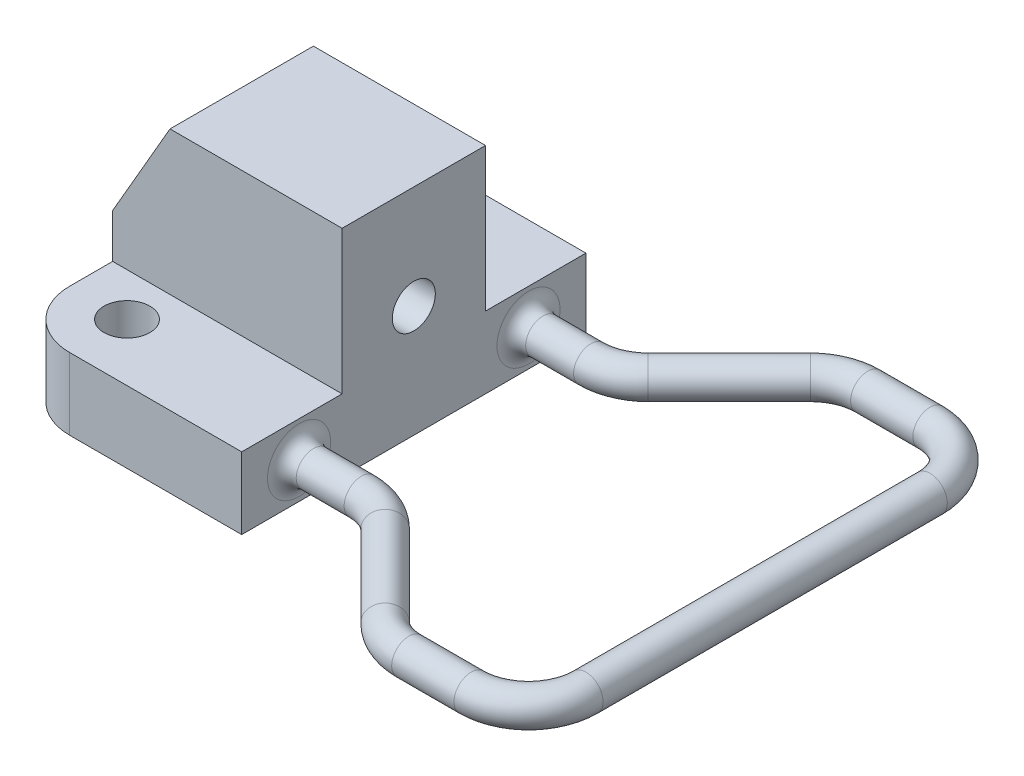
ISO-10303-21;
HEADER;
FILE_DESCRIPTION(('STEP AP214'),'2;1');
FILE_NAME('part.step','',(''),(''),'','','');
FILE_SCHEMA(('AUTOMOTIVE_DESIGN { 1 0 10303 214 1 1 1 1 }'));
ENDSEC;
DATA;
#1=APPLICATION_CONTEXT('core data for automotive mechanical design processes');
#2=APPLICATION_PROTOCOL_DEFINITION('international standard','automotive_design',2000,#1);
#3=PRODUCT_CONTEXT('',#1,'mechanical');
#4=PRODUCT('Part','Part','',(#3));
#5=PRODUCT_RELATED_PRODUCT_CATEGORY('part','',(#4));
#6=PRODUCT_DEFINITION_FORMATION('','',#4);
#7=PRODUCT_DEFINITION_CONTEXT('part definition',#1,'design');
#8=PRODUCT_DEFINITION('design','',#6,#7);
#9=PRODUCT_DEFINITION_SHAPE('','',#8);
#10=(LENGTH_UNIT() NAMED_UNIT(*) SI_UNIT(.MILLI.,.METRE.));
#11=(NAMED_UNIT(*) PLANE_ANGLE_UNIT() SI_UNIT($,.RADIAN.));
#12=(NAMED_UNIT(*) SI_UNIT($,.STERADIAN.) SOLID_ANGLE_UNIT());
#13=UNCERTAINTY_MEASURE_WITH_UNIT(LENGTH_MEASURE(1.E-05),#10,'distance_accuracy_value','');
#14=(GEOMETRIC_REPRESENTATION_CONTEXT(3) GLOBAL_UNCERTAINTY_ASSIGNED_CONTEXT((#13)) GLOBAL_UNIT_ASSIGNED_CONTEXT((#10,
#11,#12)) REPRESENTATION_CONTEXT('',''));
#15=CARTESIAN_POINT('',(0.,0.,0.));
#16=DIRECTION('',(0.,0.,1.));
#17=DIRECTION('',(1.,0.,0.));
#18=AXIS2_PLACEMENT_3D('',#15,#16,#17);
#19=CARTESIAN_POINT('',(40.,25.,-60.));
#20=DIRECTION('',(-1.,0.,0.));
#21=DIRECTION('',(0.,0.,1.));
#22=AXIS2_PLACEMENT_3D('',#19,#20,#21);
#23=PLANE('',#22);
#24=CARTESIAN_POINT('',(40.,12.5,40.));
#25=DIRECTION('',(-1.,0.,0.));
#26=DIRECTION('',(0.,0.,1.));
#27=AXIS2_PLACEMENT_3D('',#24,#25,#26);
#28=CIRCLE('',#27,11.);
#29=CARTESIAN_POINT('',(40.,12.5,51.));
#30=VERTEX_POINT('',#29);
#31=EDGE_CURVE('E61',#30,#30,#28,.T.);
#32=ORIENTED_EDGE('',*,*,#31,.T.);
#33=EDGE_LOOP('',(#32));
#34=FACE_BOUND('',#33,.T.);
#35=CARTESIAN_POINT('',(40.,12.5,-40.));
#36=DIRECTION('',(-1.,0.,0.));
#37=DIRECTION('',(0.,0.,1.));
#38=AXIS2_PLACEMENT_3D('',#35,#36,#37);
#39=CIRCLE('',#38,11.);
#40=CARTESIAN_POINT('',(40.,12.5,-29.));
#41=VERTEX_POINT('',#40);
#42=EDGE_CURVE('E177',#41,#41,#39,.T.);
#43=ORIENTED_EDGE('',*,*,#42,.T.);
#44=EDGE_LOOP('',(#43));
#45=FACE_BOUND('',#44,.T.);
#46=CARTESIAN_POINT('',(40.,39.,0.));
#47=DIRECTION('',(-1.,0.,0.));
#48=DIRECTION('',(0.,0.,1.));
#49=AXIS2_PLACEMENT_3D('',#46,#47,#48);
#50=CIRCLE('',#49,7.5);
#51=CARTESIAN_POINT('',(40.,39.,7.5));
#52=VERTEX_POINT('',#51);
#53=EDGE_CURVE('E250',#52,#52,#50,.T.);
#54=ORIENTED_EDGE('',*,*,#53,.T.);
#55=EDGE_LOOP('',(#54));
#56=FACE_BOUND('',#55,.T.);
#57=DIRECTION('',(0.,0.,-1.));
#58=VECTOR('',#57,1.);
#59=CARTESIAN_POINT('',(40.,0.,-60.));
#60=LINE('',#59,#58);
#61=CARTESIAN_POINT('',(40.,0.,60.));
#62=VERTEX_POINT('',#61);
#63=CARTESIAN_POINT('',(40.,0.,-60.));
#64=VERTEX_POINT('',#63);
#65=EDGE_CURVE('E153',#62,#64,#60,.T.);
#66=ORIENTED_EDGE('',*,*,#65,.T.);
#67=DIRECTION('',(0.,-1.,0.));
#68=VECTOR('',#67,1.);
#69=CARTESIAN_POINT('',(40.,25.,-60.));
#70=LINE('',#69,#68);
#71=CARTESIAN_POINT('',(40.,25.,-60.));
#72=VERTEX_POINT('',#71);
#73=EDGE_CURVE('E171',#72,#64,#70,.T.);
#74=ORIENTED_EDGE('',*,*,#73,.F.);
#75=DIRECTION('',(0.,0.,-1.));
#76=VECTOR('',#75,1.);
#77=CARTESIAN_POINT('',(40.,25.,-60.));
#78=LINE('',#77,#76);
#79=CARTESIAN_POINT('',(40.,25.,-25.));
#80=VERTEX_POINT('',#79);
#81=EDGE_CURVE('E113',#80,#72,#78,.T.);
#82=ORIENTED_EDGE('',*,*,#81,.F.);
#83=DIRECTION('',(0.,-1.,0.));
#84=VECTOR('',#83,1.);
#85=CARTESIAN_POINT('',(40.,75.,-25.));
#86=LINE('',#85,#84);
#87=CARTESIAN_POINT('',(40.,75.,-25.));
#88=VERTEX_POINT('',#87);
#89=EDGE_CURVE('E269',#88,#80,#86,.T.);
#90=ORIENTED_EDGE('',*,*,#89,.F.);
#91=DIRECTION('',(0.,0.,-1.));
#92=VECTOR('',#91,1.);
#93=CARTESIAN_POINT('',(40.,75.,25.));
#94=LINE('',#93,#92);
#95=CARTESIAN_POINT('',(40.,75.,25.));
#96=VERTEX_POINT('',#95);
#97=EDGE_CURVE('E266',#96,#88,#94,.T.);
#98=ORIENTED_EDGE('',*,*,#97,.F.);
#99=DIRECTION('',(0.,-1.,0.));
#100=VECTOR('',#99,1.);
#101=CARTESIAN_POINT('',(40.,75.,25.));
#102=LINE('',#101,#100);
#103=CARTESIAN_POINT('',(40.,25.,25.));
#104=VERTEX_POINT('',#103);
#105=EDGE_CURVE('E257',#96,#104,#102,.T.);
#106=ORIENTED_EDGE('',*,*,#105,.T.);
#107=CARTESIAN_POINT('',(40.,25.,60.));
#108=VERTEX_POINT('',#107);
#109=EDGE_CURVE('E299',#108,#104,#78,.T.);
#110=ORIENTED_EDGE('',*,*,#109,.F.);
#111=DIRECTION('',(0.,-1.,0.));
#112=VECTOR('',#111,1.);
#113=CARTESIAN_POINT('',(40.,25.,60.));
#114=LINE('',#113,#112);
#115=EDGE_CURVE('E148',#108,#62,#114,.T.);
#116=ORIENTED_EDGE('',*,*,#115,.T.);
#117=EDGE_LOOP('',(#66,#74,#82,#90,#98,#106,#110,#116));
#118=FACE_BOUND('',#117,.T.);
#119=ADVANCED_FACE('F53',(#34,#45,#56,#118),#23,.F.);
#120=CARTESIAN_POINT('',(-20.,25.,40.));
#121=DIRECTION('',(0.,1.,0.));
#122=DIRECTION('',(0.,0.,1.));
#123=AXIS2_PLACEMENT_3D('',#120,#121,#122);
#124=PLANE('',#123);
#125=CARTESIAN_POINT('',(-20.,25.,40.));
#126=DIRECTION('',(0.,1.,0.));
#127=DIRECTION('',(0.,0.,1.));
#128=AXIS2_PLACEMENT_3D('',#125,#126,#127);
#129=CIRCLE('',#128,8.);
#130=CARTESIAN_POINT('',(-20.,25.,48.));
#131=VERTEX_POINT('',#130);
#132=EDGE_CURVE('E157',#131,#131,#129,.T.);
#133=ORIENTED_EDGE('',*,*,#132,.F.);
#134=EDGE_LOOP('',(#133));
#135=FACE_BOUND('',#134,.T.);
#136=ORIENTED_EDGE('',*,*,#109,.T.);
#137=DIRECTION('',(-1.,0.,0.));
#138=VECTOR('',#137,1.);
#139=CARTESIAN_POINT('',(40.,25.,25.));
#140=LINE('',#139,#138);
#141=CARTESIAN_POINT('',(-40.,25.,25.));
#142=VERTEX_POINT('',#141);
#143=EDGE_CURVE('E130',#104,#142,#140,.T.);
#144=ORIENTED_EDGE('',*,*,#143,.T.);
#145=DIRECTION('',(0.,0.,1.));
#146=VECTOR('',#145,1.);
#147=CARTESIAN_POINT('',(-40.,25.,-39.9999999999998));
#148=LINE('',#147,#146);
#149=CARTESIAN_POINT('',(-40.,25.,39.9999999999999));
#150=VERTEX_POINT('',#149);
#151=EDGE_CURVE('E124',#142,#150,#148,.T.);
#152=ORIENTED_EDGE('',*,*,#151,.T.);
#153=CARTESIAN_POINT('',(-20.,25.,40.));
#154=DIRECTION('',(0.,1.,0.));
#155=DIRECTION('',(0.,0.,1.));
#156=AXIS2_PLACEMENT_3D('',#153,#154,#155);
#157=CIRCLE('',#156,20.);
#158=CARTESIAN_POINT('',(-19.9999999999999,25.,60.));
#159=VERTEX_POINT('',#158);
#160=EDGE_CURVE('E128',#150,#159,#157,.T.);
#161=ORIENTED_EDGE('',*,*,#160,.T.);
#162=DIRECTION('',(1.,0.,0.));
#163=VECTOR('',#162,1.);
#164=CARTESIAN_POINT('',(-19.9999999999999,25.,60.));
#165=LINE('',#164,#163);
#166=EDGE_CURVE('E77',#159,#108,#165,.T.);
#167=ORIENTED_EDGE('',*,*,#166,.T.);
#168=EDGE_LOOP('',(#136,#144,#152,#161,#167));
#169=FACE_BOUND('',#168,.T.);
#170=ADVANCED_FACE('F126',(#135,#169),#124,.T.);
#171=DIRECTION('',(-1.,0.,0.));
#172=VECTOR('',#171,1.);
#173=CARTESIAN_POINT('',(40.,25.,-25.));
#174=LINE('',#173,#172);
#175=CARTESIAN_POINT('',(-40.,25.,-25.));
#176=VERTEX_POINT('',#175);
#177=EDGE_CURVE('E272',#80,#176,#174,.T.);
#178=ORIENTED_EDGE('',*,*,#177,.F.);
#179=ORIENTED_EDGE('',*,*,#81,.T.);
#180=DIRECTION('',(-1.,0.,0.));
#181=VECTOR('',#180,1.);
#182=CARTESIAN_POINT('',(-19.9999999999999,25.,-60.));
#183=LINE('',#182,#181);
#184=CARTESIAN_POINT('',(-19.9999999999999,25.,-60.));
#185=VERTEX_POINT('',#184);
#186=EDGE_CURVE('E301',#72,#185,#183,.T.);
#187=ORIENTED_EDGE('',*,*,#186,.T.);
#188=CARTESIAN_POINT('',(-20.,25.,-40.));
#189=DIRECTION('',(0.,1.,0.));
#190=DIRECTION('',(0.,0.,1.));
#191=AXIS2_PLACEMENT_3D('',#188,#189,#190);
#192=CIRCLE('',#191,20.);
#193=CARTESIAN_POINT('',(-40.,25.,-39.9999999999998));
#194=VERTEX_POINT('',#193);
#195=EDGE_CURVE('E133',#185,#194,#192,.T.);
#196=ORIENTED_EDGE('',*,*,#195,.T.);
#197=EDGE_CURVE('E132',#194,#176,#148,.T.);
#198=ORIENTED_EDGE('',*,*,#197,.T.);
#199=EDGE_LOOP('',(#178,#179,#187,#196,#198));
#200=FACE_BOUND('',#199,.T.);
#201=CARTESIAN_POINT('',(-20.,25.,-40.));
#202=DIRECTION('',(0.,1.,0.));
#203=DIRECTION('',(0.,0.,1.));
#204=AXIS2_PLACEMENT_3D('',#201,#202,#203);
#205=CIRCLE('',#204,8.);
#206=CARTESIAN_POINT('',(-20.,25.,-32.));
#207=VERTEX_POINT('',#206);
#208=EDGE_CURVE('E289',#207,#207,#205,.T.);
#209=ORIENTED_EDGE('',*,*,#208,.F.);
#210=EDGE_LOOP('',(#209));
#211=FACE_BOUND('',#210,.T.);
#212=ADVANCED_FACE('F304',(#200,#211),#124,.T.);
#213=CARTESIAN_POINT('',(-20.,0.,40.));
#214=DIRECTION('',(0.,1.,0.));
#215=DIRECTION('',(0.,0.,1.));
#216=AXIS2_PLACEMENT_3D('',#213,#214,#215);
#217=PLANE('',#216);
#218=ORIENTED_EDGE('',*,*,#65,.F.);
#219=DIRECTION('',(1.,0.,0.));
#220=VECTOR('',#219,1.);
#221=CARTESIAN_POINT('',(-19.9999999999999,0.,60.));
#222=LINE('',#221,#220);
#223=CARTESIAN_POINT('',(-19.9999999999999,0.,60.));
#224=VERTEX_POINT('',#223);
#225=EDGE_CURVE('E104',#224,#62,#222,.T.);
#226=ORIENTED_EDGE('',*,*,#225,.F.);
#227=CARTESIAN_POINT('',(-20.,0.,40.));
#228=DIRECTION('',(0.,1.,0.));
#229=DIRECTION('',(0.,0.,1.));
#230=AXIS2_PLACEMENT_3D('',#227,#228,#229);
#231=CIRCLE('',#230,20.);
#232=CARTESIAN_POINT('',(-40.,0.,39.9999999999999));
#233=VERTEX_POINT('',#232);
#234=EDGE_CURVE('E162',#233,#224,#231,.T.);
#235=ORIENTED_EDGE('',*,*,#234,.F.);
#236=DIRECTION('',(0.,0.,1.));
#237=VECTOR('',#236,1.);
#238=CARTESIAN_POINT('',(-40.,0.,-39.9999999999998));
#239=LINE('',#238,#237);
#240=CARTESIAN_POINT('',(-40.,0.,-39.9999999999998));
#241=VERTEX_POINT('',#240);
#242=EDGE_CURVE('E140',#241,#233,#239,.T.);
#243=ORIENTED_EDGE('',*,*,#242,.F.);
#244=CARTESIAN_POINT('',(-20.,0.,-40.));
#245=DIRECTION('',(0.,1.,0.));
#246=DIRECTION('',(0.,0.,1.));
#247=AXIS2_PLACEMENT_3D('',#244,#245,#246);
#248=CIRCLE('',#247,20.);
#249=CARTESIAN_POINT('',(-19.9999999999999,0.,-60.));
#250=VERTEX_POINT('',#249);
#251=EDGE_CURVE('E159',#250,#241,#248,.T.);
#252=ORIENTED_EDGE('',*,*,#251,.F.);
#253=DIRECTION('',(-1.,0.,0.));
#254=VECTOR('',#253,1.);
#255=CARTESIAN_POINT('',(-19.9999999999999,0.,-60.));
#256=LINE('',#255,#254);
#257=EDGE_CURVE('E156',#64,#250,#256,.T.);
#258=ORIENTED_EDGE('',*,*,#257,.F.);
#259=EDGE_LOOP('',(#218,#226,#235,#243,#252,#258));
#260=FACE_BOUND('',#259,.T.);
#261=CARTESIAN_POINT('',(-20.,0.,40.));
#262=DIRECTION('',(0.,1.,0.));
#263=DIRECTION('',(0.,0.,1.));
#264=AXIS2_PLACEMENT_3D('',#261,#262,#263);
#265=CIRCLE('',#264,8.);
#266=CARTESIAN_POINT('',(-20.,0.,48.));
#267=VERTEX_POINT('',#266);
#268=EDGE_CURVE('E292',#267,#267,#265,.T.);
#269=ORIENTED_EDGE('',*,*,#268,.T.);
#270=EDGE_LOOP('',(#269));
#271=FACE_BOUND('',#270,.T.);
#272=CARTESIAN_POINT('',(-20.,0.,-40.));
#273=DIRECTION('',(0.,1.,0.));
#274=DIRECTION('',(0.,0.,1.));
#275=AXIS2_PLACEMENT_3D('',#272,#273,#274);
#276=CIRCLE('',#275,8.);
#277=CARTESIAN_POINT('',(-20.,0.,-32.));
#278=VERTEX_POINT('',#277);
#279=EDGE_CURVE('E283',#278,#278,#276,.T.);
#280=ORIENTED_EDGE('',*,*,#279,.T.);
#281=EDGE_LOOP('',(#280));
#282=FACE_BOUND('',#281,.T.);
#283=ADVANCED_FACE('F330',(#260,#271,#282),#217,.F.);
#284=CARTESIAN_POINT('',(-19.9999999999999,25.,-60.));
#285=DIRECTION('',(0.,0.,1.));
#286=DIRECTION('',(1.,0.,0.));
#287=AXIS2_PLACEMENT_3D('',#284,#285,#286);
#288=PLANE('',#287);
#289=ORIENTED_EDGE('',*,*,#257,.T.);
#290=DIRECTION('',(0.,-1.,0.));
#291=VECTOR('',#290,1.);
#292=CARTESIAN_POINT('',(-19.9999999999999,25.,-60.));
#293=LINE('',#292,#291);
#294=EDGE_CURVE('E168',#185,#250,#293,.T.);
#295=ORIENTED_EDGE('',*,*,#294,.F.);
#296=ORIENTED_EDGE('',*,*,#186,.F.);
#297=ORIENTED_EDGE('',*,*,#73,.T.);
#298=EDGE_LOOP('',(#289,#295,#296,#297));
#299=FACE_BOUND('',#298,.T.);
#300=ADVANCED_FACE('F328',(#299),#288,.F.);
#301=CARTESIAN_POINT('',(-20.,25.,-40.));
#302=DIRECTION('',(0.,-1.,0.));
#303=DIRECTION('',(0.,0.,-1.));
#304=AXIS2_PLACEMENT_3D('',#301,#302,#303);
#305=CYLINDRICAL_SURFACE('',#304,20.);
#306=ORIENTED_EDGE('',*,*,#251,.T.);
#307=DIRECTION('',(0.,-1.,0.));
#308=VECTOR('',#307,1.);
#309=CARTESIAN_POINT('',(-40.,25.,-39.9999999999998));
#310=LINE('',#309,#308);
#311=EDGE_CURVE('E143',#194,#241,#310,.T.);
#312=ORIENTED_EDGE('',*,*,#311,.F.);
#313=ORIENTED_EDGE('',*,*,#195,.F.);
#314=ORIENTED_EDGE('',*,*,#294,.T.);
#315=EDGE_LOOP('',(#306,#312,#313,#314));
#316=FACE_BOUND('',#315,.T.);
#317=ADVANCED_FACE('F310',(#316),#305,.T.);
#318=CARTESIAN_POINT('',(-40.,25.,-39.9999999999998));
#319=DIRECTION('',(1.,0.,0.));
#320=DIRECTION('',(0.,0.,-1.));
#321=AXIS2_PLACEMENT_3D('',#318,#319,#320);
#322=PLANE('',#321);
#323=ORIENTED_EDGE('',*,*,#242,.T.);
#324=DIRECTION('',(0.,-1.,0.));
#325=VECTOR('',#324,1.);
#326=CARTESIAN_POINT('',(-40.,25.,39.9999999999999));
#327=LINE('',#326,#325);
#328=EDGE_CURVE('E136',#150,#233,#327,.T.);
#329=ORIENTED_EDGE('',*,*,#328,.F.);
#330=ORIENTED_EDGE('',*,*,#151,.F.);
#331=DIRECTION('',(0.,1.,0.));
#332=VECTOR('',#331,1.);
#333=CARTESIAN_POINT('',(-40.,25.,25.));
#334=LINE('',#333,#332);
#335=CARTESIAN_POINT('',(-40.,40.3589838486226,25.));
#336=VERTEX_POINT('',#335);
#337=EDGE_CURVE('E68',#142,#336,#334,.T.);
#338=ORIENTED_EDGE('',*,*,#337,.T.);
#339=DIRECTION('',(0.,0.,-1.));
#340=VECTOR('',#339,1.);
#341=CARTESIAN_POINT('',(-40.,40.3589838486226,25.));
#342=LINE('',#341,#340);
#343=CARTESIAN_POINT('',(-40.,40.3589838486226,-25.));
#344=VERTEX_POINT('',#343);
#345=EDGE_CURVE('E284',#336,#344,#342,.T.);
#346=ORIENTED_EDGE('',*,*,#345,.T.);
#347=DIRECTION('',(0.,1.,0.));
#348=VECTOR('',#347,1.);
#349=CARTESIAN_POINT('',(-40.,25.,-25.));
#350=LINE('',#349,#348);
#351=EDGE_CURVE('E275',#176,#344,#350,.T.);
#352=ORIENTED_EDGE('',*,*,#351,.F.);
#353=ORIENTED_EDGE('',*,*,#197,.F.);
#354=ORIENTED_EDGE('',*,*,#311,.T.);
#355=EDGE_LOOP('',(#323,#329,#330,#338,#346,#352,#353,#354));
#356=FACE_BOUND('',#355,.T.);
#357=ADVANCED_FACE('F137',(#356),#322,.F.);
#358=CARTESIAN_POINT('',(-20.,25.,40.));
#359=DIRECTION('',(0.,-1.,0.));
#360=DIRECTION('',(0.,0.,-1.));
#361=AXIS2_PLACEMENT_3D('',#358,#359,#360);
#362=CYLINDRICAL_SURFACE('',#361,20.);
#363=ORIENTED_EDGE('',*,*,#234,.T.);
#364=DIRECTION('',(0.,-1.,0.));
#365=VECTOR('',#364,1.);
#366=CARTESIAN_POINT('',(-19.9999999999999,25.,60.));
#367=LINE('',#366,#365);
#368=EDGE_CURVE('E144',#159,#224,#367,.T.);
#369=ORIENTED_EDGE('',*,*,#368,.F.);
#370=ORIENTED_EDGE('',*,*,#160,.F.);
#371=ORIENTED_EDGE('',*,*,#328,.T.);
#372=EDGE_LOOP('',(#363,#369,#370,#371));
#373=FACE_BOUND('',#372,.T.);
#374=ADVANCED_FACE('F146',(#373),#362,.T.);
#375=CARTESIAN_POINT('',(-19.9999999999999,25.,60.));
#376=DIRECTION('',(0.,0.,-1.));
#377=DIRECTION('',(-1.,0.,0.));
#378=AXIS2_PLACEMENT_3D('',#375,#376,#377);
#379=PLANE('',#378);
#380=ORIENTED_EDGE('',*,*,#225,.T.);
#381=ORIENTED_EDGE('',*,*,#115,.F.);
#382=ORIENTED_EDGE('',*,*,#166,.F.);
#383=ORIENTED_EDGE('',*,*,#368,.T.);
#384=EDGE_LOOP('',(#380,#381,#382,#383));
#385=FACE_BOUND('',#384,.T.);
#386=ADVANCED_FACE('F332',(#385),#379,.F.);
#387=CARTESIAN_POINT('',(-20.,25.,40.));
#388=DIRECTION('',(0.,-1.,0.));
#389=DIRECTION('',(0.,0.,-1.));
#390=AXIS2_PLACEMENT_3D('',#387,#388,#389);
#391=CYLINDRICAL_SURFACE('',#390,8.);
#392=ORIENTED_EDGE('',*,*,#132,.T.);
#393=EDGE_LOOP('',(#392));
#394=FACE_BOUND('',#393,.T.);
#395=ORIENTED_EDGE('',*,*,#268,.F.);
#396=EDGE_LOOP('',(#395));
#397=FACE_BOUND('',#396,.T.);
#398=ADVANCED_FACE('F382',(#394,#397),#391,.F.);
#399=CARTESIAN_POINT('',(-20.,25.,-40.));
#400=DIRECTION('',(0.,-1.,0.));
#401=DIRECTION('',(0.,0.,-1.));
#402=AXIS2_PLACEMENT_3D('',#399,#400,#401);
#403=CYLINDRICAL_SURFACE('',#402,8.);
#404=ORIENTED_EDGE('',*,*,#208,.T.);
#405=EDGE_LOOP('',(#404));
#406=FACE_BOUND('',#405,.T.);
#407=ORIENTED_EDGE('',*,*,#279,.F.);
#408=EDGE_LOOP('',(#407));
#409=FACE_BOUND('',#408,.T.);
#410=ADVANCED_FACE('F388',(#406,#409),#403,.F.);
#411=CARTESIAN_POINT('',(-20.,75.,25.));
#412=DIRECTION('',(0.,1.,0.));
#413=DIRECTION('',(0.,0.,1.));
#414=AXIS2_PLACEMENT_3D('',#411,#412,#413);
#415=PLANE('',#414);
#416=DIRECTION('',(1.,0.,0.));
#417=VECTOR('',#416,1.);
#418=CARTESIAN_POINT('',(-20.,75.,-25.));
#419=LINE('',#418,#417);
#420=CARTESIAN_POINT('',(-20.,75.,-25.));
#421=VERTEX_POINT('',#420);
#422=EDGE_CURVE('E253',#421,#88,#419,.T.);
#423=ORIENTED_EDGE('',*,*,#422,.F.);
#424=DIRECTION('',(0.,0.,-1.));
#425=VECTOR('',#424,1.);
#426=CARTESIAN_POINT('',(-20.,75.,25.));
#427=LINE('',#426,#425);
#428=CARTESIAN_POINT('',(-20.,75.,25.));
#429=VERTEX_POINT('',#428);
#430=EDGE_CURVE('E280',#429,#421,#427,.T.);
#431=ORIENTED_EDGE('',*,*,#430,.F.);
#432=DIRECTION('',(1.,0.,0.));
#433=VECTOR('',#432,1.);
#434=CARTESIAN_POINT('',(-20.,75.,25.));
#435=LINE('',#434,#433);
#436=EDGE_CURVE('E254',#429,#96,#435,.T.);
#437=ORIENTED_EDGE('',*,*,#436,.T.);
#438=ORIENTED_EDGE('',*,*,#97,.T.);
#439=EDGE_LOOP('',(#423,#431,#437,#438));
#440=FACE_BOUND('',#439,.T.);
#441=ADVANCED_FACE('F349',(#440),#415,.T.);
#442=CARTESIAN_POINT('',(-40.,40.3589838486226,25.));
#443=DIRECTION('',(-0.866025403784438,0.500000000000001,0.));
#444=DIRECTION('',(-0.500000000000001,-0.866025403784438,0.));
#445=AXIS2_PLACEMENT_3D('',#442,#443,#444);
#446=PLANE('',#445);
#447=CARTESIAN_POINT('',(-30.,57.6794919243113,0.));
#448=DIRECTION('',(-0.866025403784438,0.500000000000001,0.));
#449=DIRECTION('',(-0.500000000000001,-0.866025403784438,0.));
#450=AXIS2_PLACEMENT_3D('',#447,#448,#449);
#451=CIRCLE('',#450,7.5);
#452=CARTESIAN_POINT('',(-33.75,51.184301395928,0.));
#453=VERTEX_POINT('',#452);
#454=EDGE_CURVE('E239',#453,#453,#451,.T.);
#455=ORIENTED_EDGE('',*,*,#454,.F.);
#456=EDGE_LOOP('',(#455));
#457=FACE_BOUND('',#456,.T.);
#458=DIRECTION('',(0.500000000000001,0.866025403784438,0.));
#459=VECTOR('',#458,1.);
#460=CARTESIAN_POINT('',(-40.,40.3589838486226,-25.));
#461=LINE('',#460,#459);
#462=EDGE_CURVE('E258',#344,#421,#461,.T.);
#463=ORIENTED_EDGE('',*,*,#462,.F.);
#464=ORIENTED_EDGE('',*,*,#345,.F.);
#465=DIRECTION('',(0.500000000000001,0.866025403784438,0.));
#466=VECTOR('',#465,1.);
#467=CARTESIAN_POINT('',(-40.,40.3589838486226,25.));
#468=LINE('',#467,#466);
#469=EDGE_CURVE('E263',#336,#429,#468,.T.);
#470=ORIENTED_EDGE('',*,*,#469,.T.);
#471=ORIENTED_EDGE('',*,*,#430,.T.);
#472=EDGE_LOOP('',(#463,#464,#470,#471));
#473=FACE_BOUND('',#472,.T.);
#474=ADVANCED_FACE('F346',(#457,#473),#446,.T.);
#475=CARTESIAN_POINT('',(0.,0.,25.));
#476=DIRECTION('',(0.,0.,-1.));
#477=DIRECTION('',(-1.,0.,0.));
#478=AXIS2_PLACEMENT_3D('',#475,#476,#477);
#479=PLANE('',#478);
#480=ORIENTED_EDGE('',*,*,#436,.F.);
#481=ORIENTED_EDGE('',*,*,#469,.F.);
#482=ORIENTED_EDGE('',*,*,#337,.F.);
#483=ORIENTED_EDGE('',*,*,#143,.F.);
#484=ORIENTED_EDGE('',*,*,#105,.F.);
#485=EDGE_LOOP('',(#480,#481,#482,#483,#484));
#486=FACE_BOUND('',#485,.T.);
#487=ADVANCED_FACE('F350',(#486),#479,.F.);
#488=CARTESIAN_POINT('',(0.,0.,-25.));
#489=DIRECTION('',(0.,0.,-1.));
#490=DIRECTION('',(-1.,0.,0.));
#491=AXIS2_PLACEMENT_3D('',#488,#489,#490);
#492=PLANE('',#491);
#493=ORIENTED_EDGE('',*,*,#422,.T.);
#494=ORIENTED_EDGE('',*,*,#89,.T.);
#495=ORIENTED_EDGE('',*,*,#177,.T.);
#496=ORIENTED_EDGE('',*,*,#351,.T.);
#497=ORIENTED_EDGE('',*,*,#462,.T.);
#498=EDGE_LOOP('',(#493,#494,#495,#496,#497));
#499=FACE_BOUND('',#498,.T.);
#500=ADVANCED_FACE('F319',(#499),#492,.T.);
#501=CARTESIAN_POINT('',(-33.4641016151352,59.6794919243098,0.));
#502=DIRECTION('',(0.866025403784439,-0.5,0.));
#503=DIRECTION('',(0.5,0.866025403784439,0.));
#504=AXIS2_PLACEMENT_3D('',#501,#502,#503);
#505=CYLINDRICAL_SURFACE('',#504,7.5);
#506=CARTESIAN_POINT('',(-14.1925192414929,48.5530386531774,0.));
#507=DIRECTION('',(-0.866025403784438,0.500000000000001,0.));
#508=DIRECTION('',(-0.500000000000001,-0.866025403784438,0.));
#509=AXIS2_PLACEMENT_3D('',#506,#507,#508);
#510=CIRCLE('',#509,7.5);
#511=CARTESIAN_POINT('',(-17.9425192414929,42.0578481247941,0.));
#512=VERTEX_POINT('',#511);
#513=EDGE_CURVE('E235',#512,#512,#510,.T.);
#514=ORIENTED_EDGE('',*,*,#513,.F.);
#515=EDGE_LOOP('',(#514));
#516=FACE_BOUND('',#515,.T.);
#517=ORIENTED_EDGE('',*,*,#454,.T.);
#518=EDGE_LOOP('',(#517));
#519=FACE_BOUND('',#518,.T.);
#520=ADVANCED_FACE('F357',(#516,#519),#505,.F.);
#521=CARTESIAN_POINT('',(-14.1925192414929,48.5530386531774,0.));
#522=DIRECTION('',(0.866025403784438,-0.500000000000001,0.));
#523=DIRECTION('',(0.500000000000001,0.866025403784438,0.));
#524=AXIS2_PLACEMENT_3D('',#521,#522,#523);
#525=CYLINDRICAL_SURFACE('',#524,7.5);
#526=CARTESIAN_POINT('',(-4.60769515458668,43.0192378864669,0.));
#527=DIRECTION('',(-0.866025403784438,0.500000000000001,0.));
#528=DIRECTION('',(-0.500000000000001,-0.866025403784438,0.));
#529=AXIS2_PLACEMENT_3D('',#526,#527,#528);
#530=CIRCLE('',#529,7.5);
#531=CARTESIAN_POINT('',(-8.35769515458666,36.5240473580836,0.));
#532=VERTEX_POINT('',#531);
#533=EDGE_CURVE('E243',#532,#532,#530,.T.);
#534=ORIENTED_EDGE('',*,*,#533,.F.);
#535=EDGE_LOOP('',(#534));
#536=FACE_BOUND('',#535,.T.);
#537=ORIENTED_EDGE('',*,*,#513,.T.);
#538=EDGE_LOOP('',(#537));
#539=FACE_BOUND('',#538,.T.);
#540=ADVANCED_FACE('F481',(#536,#539),#525,.F.);
#541=CARTESIAN_POINT('',(10.3923048454133,69.,0.));
#542=DIRECTION('',(0.,0.,1.));
#543=DIRECTION('',(1.,0.,0.));
#544=AXIS2_PLACEMENT_3D('',#541,#542,#543);
#545=TOROIDAL_SURFACE('',#544,29.9999999999999,7.5);
#546=CARTESIAN_POINT('',(10.3923048454133,39.,0.));
#547=DIRECTION('',(-1.,0.,0.));
#548=DIRECTION('',(0.,-1.,0.));
#549=AXIS2_PLACEMENT_3D('',#546,#547,#548);
#550=CIRCLE('',#549,7.5);
#551=CARTESIAN_POINT('',(10.3923048454133,31.5000000000001,0.));
#552=VERTEX_POINT('',#551);
#553=EDGE_CURVE('E240',#552,#552,#550,.T.);
#554=CARTESIAN_POINT('',(10.3923048454133,69.,0.));
#555=DIRECTION('',(0.,0.,1.));
#556=DIRECTION('',(1.,0.,0.));
#557=AXIS2_PLACEMENT_3D('',#554,#555,#556);
#558=CIRCLE('',#557,37.4999999999999);
#559=EDGE_CURVE('',#532,#552,#558,.T.);
#560=ORIENTED_EDGE('',*,*,#533,.T.);
#561=ORIENTED_EDGE('',*,*,#553,.F.);
#562=ORIENTED_EDGE('',*,*,#559,.T.);
#563=ORIENTED_EDGE('',*,*,#559,.F.);
#564=EDGE_LOOP('',(#560,#562,#561,#563));
#565=FACE_BOUND('',#564,.T.);
#566=ADVANCED_FACE('F489',(#565),#545,.F.);
#567=CARTESIAN_POINT('',(10.3923048454133,39.,0.));
#568=DIRECTION('',(1.,0.,0.));
#569=DIRECTION('',(0.,1.,0.));
#570=AXIS2_PLACEMENT_3D('',#567,#568,#569);
#571=CYLINDRICAL_SURFACE('',#570,7.5);
#572=CARTESIAN_POINT('',(21.3382643128269,39.,0.));
#573=DIRECTION('',(-1.,0.,0.));
#574=DIRECTION('',(0.,-1.,0.));
#575=AXIS2_PLACEMENT_3D('',#572,#573,#574);
#576=CIRCLE('',#575,7.5);
#577=CARTESIAN_POINT('',(21.3382643128269,31.5,0.));
#578=VERTEX_POINT('',#577);
#579=EDGE_CURVE('E236',#578,#578,#576,.T.);
#580=ORIENTED_EDGE('',*,*,#579,.F.);
#581=EDGE_LOOP('',(#580));
#582=FACE_BOUND('',#581,.T.);
#583=ORIENTED_EDGE('',*,*,#553,.T.);
#584=EDGE_LOOP('',(#583));
#585=FACE_BOUND('',#584,.T.);
#586=ADVANCED_FACE('F498',(#582,#585),#571,.F.);
#587=CARTESIAN_POINT('',(21.3382643128269,39.,0.));
#588=DIRECTION('',(1.,0.,0.));
#589=DIRECTION('',(0.,0.,-1.));
#590=AXIS2_PLACEMENT_3D('',#587,#588,#589);
#591=CYLINDRICAL_SURFACE('',#590,7.5);
#592=ORIENTED_EDGE('',*,*,#53,.F.);
#593=EDGE_LOOP('',(#592));
#594=FACE_BOUND('',#593,.T.);
#595=ORIENTED_EDGE('',*,*,#579,.T.);
#596=EDGE_LOOP('',(#595));
#597=FACE_BOUND('',#596,.T.);
#598=ADVANCED_FACE('F194',(#594,#597),#591,.F.);
#599=CARTESIAN_POINT('',(40.,12.5,40.));
#600=DIRECTION('',(1.,0.,0.));
#601=DIRECTION('',(0.,0.,-1.));
#602=AXIS2_PLACEMENT_3D('',#599,#600,#601);
#603=CYLINDRICAL_SURFACE('',#602,6.);
#604=CARTESIAN_POINT('',(45.,12.5,40.));
#605=DIRECTION('',(-1.,0.,0.));
#606=DIRECTION('',(0.,0.,1.));
#607=AXIS2_PLACEMENT_3D('',#604,#605,#606);
#608=CIRCLE('',#607,6.);
#609=CARTESIAN_POINT('',(45.,12.5,46.));
#610=VERTEX_POINT('',#609);
#611=EDGE_CURVE('E174',#610,#610,#608,.F.);
#612=ORIENTED_EDGE('',*,*,#611,.T.);
#613=EDGE_LOOP('',(#612));
#614=FACE_BOUND('',#613,.T.);
#615=CARTESIAN_POINT('',(61.715728752538,12.5,40.));
#616=DIRECTION('',(1.,0.,0.));
#617=DIRECTION('',(0.,0.,-1.));
#618=AXIS2_PLACEMENT_3D('',#615,#616,#617);
#619=CIRCLE('',#618,6.);
#620=CARTESIAN_POINT('',(61.715728752538,12.5,34.0000000000001));
#621=VERTEX_POINT('',#620);
#622=EDGE_CURVE('E198',#621,#621,#619,.T.);
#623=ORIENTED_EDGE('',*,*,#622,.F.);
#624=EDGE_LOOP('',(#623));
#625=FACE_BOUND('',#624,.T.);
#626=ADVANCED_FACE('F188',(#614,#625),#603,.T.);
#627=CARTESIAN_POINT('',(61.7157287525381,12.5,60.));
#628=DIRECTION('',(0.,-1.,0.));
#629=DIRECTION('',(0.,0.,-1.));
#630=AXIS2_PLACEMENT_3D('',#627,#628,#629);
#631=TOROIDAL_SURFACE('',#630,19.9999999999999,6.);
#632=CARTESIAN_POINT('',(75.8578643762691,12.5,45.8578643762691));
#633=DIRECTION('',(0.707106781186543,0.,0.707106781186552));
#634=DIRECTION('',(0.707106781186552,0.,-0.707106781186543));
#635=AXIS2_PLACEMENT_3D('',#632,#633,#634);
#636=CIRCLE('',#635,6.);
#637=CARTESIAN_POINT('',(80.1005050633883,12.5,41.61522368915));
#638=VERTEX_POINT('',#637);
#639=EDGE_CURVE('E200',#638,#638,#636,.T.);
#640=CARTESIAN_POINT('',(61.7157287525381,12.5,60.));
#641=DIRECTION('',(0.,-1.,0.));
#642=DIRECTION('',(0.,0.,-1.));
#643=AXIS2_PLACEMENT_3D('',#640,#641,#642);
#644=CIRCLE('',#643,25.9999999999999);
#645=EDGE_CURVE('',#621,#638,#644,.T.);
#646=ORIENTED_EDGE('',*,*,#622,.T.);
#647=ORIENTED_EDGE('',*,*,#639,.F.);
#648=ORIENTED_EDGE('',*,*,#645,.T.);
#649=ORIENTED_EDGE('',*,*,#645,.F.);
#650=EDGE_LOOP('',(#646,#648,#647,#649));
#651=FACE_BOUND('',#650,.T.);
#652=ADVANCED_FACE('F193',(#651),#631,.T.);
#653=CARTESIAN_POINT('',(75.8578643762691,12.5,45.8578643762691));
#654=DIRECTION('',(0.707106781186546,0.,0.707106781186549));
#655=DIRECTION('',(0.707106781186549,0.,-0.707106781186546));
#656=AXIS2_PLACEMENT_3D('',#653,#654,#655);
#657=CYLINDRICAL_SURFACE('',#656,6.);
#658=CARTESIAN_POINT('',(104.142135623731,12.5,74.1421356237309));
#659=DIRECTION('',(0.707106781186546,0.,0.707106781186549));
#660=DIRECTION('',(0.707106781186549,0.,-0.707106781186546));
#661=AXIS2_PLACEMENT_3D('',#658,#659,#660);
#662=CIRCLE('',#661,6.);
#663=CARTESIAN_POINT('',(99.8994949366115,12.5,78.3847763108501));
#664=VERTEX_POINT('',#663);
#665=EDGE_CURVE('E203',#664,#664,#662,.T.);
#666=ORIENTED_EDGE('',*,*,#665,.F.);
#667=EDGE_LOOP('',(#666));
#668=FACE_BOUND('',#667,.T.);
#669=ORIENTED_EDGE('',*,*,#639,.T.);
#670=EDGE_LOOP('',(#669));
#671=FACE_BOUND('',#670,.T.);
#672=ADVANCED_FACE('F533',(#668,#671),#657,.T.);
#673=CARTESIAN_POINT('',(118.284271247462,12.5,60.));
#674=DIRECTION('',(0.,1.,0.));
#675=DIRECTION('',(0.,0.,1.));
#676=AXIS2_PLACEMENT_3D('',#673,#674,#675);
#677=TOROIDAL_SURFACE('',#676,20.,6.);
#678=CARTESIAN_POINT('',(118.284271247462,12.5,80.0000000000002));
#679=DIRECTION('',(1.,0.,0.));
#680=DIRECTION('',(0.,0.,-1.));
#681=AXIS2_PLACEMENT_3D('',#678,#679,#680);
#682=CIRCLE('',#681,6.);
#683=CARTESIAN_POINT('',(118.284271247462,12.5,86.));
#684=VERTEX_POINT('',#683);
#685=EDGE_CURVE('E208',#684,#684,#682,.T.);
#686=CARTESIAN_POINT('',(118.284271247462,12.5,60.));
#687=DIRECTION('',(0.,1.,0.));
#688=DIRECTION('',(0.,0.,1.));
#689=AXIS2_PLACEMENT_3D('',#686,#687,#688);
#690=CIRCLE('',#689,26.);
#691=EDGE_CURVE('',#664,#684,#690,.T.);
#692=ORIENTED_EDGE('',*,*,#665,.T.);
#693=ORIENTED_EDGE('',*,*,#685,.F.);
#694=ORIENTED_EDGE('',*,*,#691,.T.);
#695=ORIENTED_EDGE('',*,*,#691,.F.);
#696=EDGE_LOOP('',(#692,#694,#693,#695));
#697=FACE_BOUND('',#696,.T.);
#698=ADVANCED_FACE('F542',(#697),#677,.T.);
#699=CARTESIAN_POINT('',(118.284271247462,12.5,80.));
#700=DIRECTION('',(1.,0.,0.));
#701=DIRECTION('',(0.,0.,-1.));
#702=AXIS2_PLACEMENT_3D('',#699,#700,#701);
#703=CYLINDRICAL_SURFACE('',#702,6.);
#704=CARTESIAN_POINT('',(140.,12.5,80.));
#705=DIRECTION('',(1.,0.,0.));
#706=DIRECTION('',(0.,0.,-1.));
#707=AXIS2_PLACEMENT_3D('',#704,#705,#706);
#708=CIRCLE('',#707,6.);
#709=CARTESIAN_POINT('',(140.,12.5,85.9999999999997));
#710=VERTEX_POINT('',#709);
#711=EDGE_CURVE('E211',#710,#710,#708,.T.);
#712=ORIENTED_EDGE('',*,*,#711,.F.);
#713=EDGE_LOOP('',(#712));
#714=FACE_BOUND('',#713,.T.);
#715=ORIENTED_EDGE('',*,*,#685,.T.);
#716=EDGE_LOOP('',(#715));
#717=FACE_BOUND('',#716,.T.);
#718=ADVANCED_FACE('F551',(#714,#717),#703,.T.);
#719=CARTESIAN_POINT('',(140.,12.5,60.));
#720=DIRECTION('',(0.,1.,0.));
#721=DIRECTION('',(0.,0.,1.));
#722=AXIS2_PLACEMENT_3D('',#719,#720,#721);
#723=TOROIDAL_SURFACE('',#722,19.9999999999997,6.);
#724=CARTESIAN_POINT('',(160.,12.5,59.9999999999999));
#725=DIRECTION('',(0.,0.,-1.));
#726=DIRECTION('',(-1.,0.,0.));
#727=AXIS2_PLACEMENT_3D('',#724,#725,#726);
#728=CIRCLE('',#727,6.);
#729=CARTESIAN_POINT('',(166.,12.5,59.9999999999998));
#730=VERTEX_POINT('',#729);
#731=EDGE_CURVE('E214',#730,#730,#728,.T.);
#732=CARTESIAN_POINT('',(140.,12.5,60.));
#733=DIRECTION('',(0.,1.,0.));
#734=DIRECTION('',(0.,0.,1.));
#735=AXIS2_PLACEMENT_3D('',#732,#733,#734);
#736=CIRCLE('',#735,25.9999999999997);
#737=EDGE_CURVE('',#710,#730,#736,.T.);
#738=ORIENTED_EDGE('',*,*,#711,.T.);
#739=ORIENTED_EDGE('',*,*,#731,.F.);
#740=ORIENTED_EDGE('',*,*,#737,.T.);
#741=ORIENTED_EDGE('',*,*,#737,.F.);
#742=EDGE_LOOP('',(#738,#740,#739,#741));
#743=FACE_BOUND('',#742,.T.);
#744=ADVANCED_FACE('F560',(#743),#723,.T.);
#745=CARTESIAN_POINT('',(160.,12.5,59.9999999999999));
#746=DIRECTION('',(0.,0.,-1.));
#747=DIRECTION('',(-1.,0.,0.));
#748=AXIS2_PLACEMENT_3D('',#745,#746,#747);
#749=CYLINDRICAL_SURFACE('',#748,6.);
#750=CARTESIAN_POINT('',(160.,12.5,-59.9999999999999));
#751=DIRECTION('',(0.,0.,-1.));
#752=DIRECTION('',(-1.,0.,0.));
#753=AXIS2_PLACEMENT_3D('',#750,#751,#752);
#754=CIRCLE('',#753,6.);
#755=CARTESIAN_POINT('',(166.,12.5,-59.9999999999998));
#756=VERTEX_POINT('',#755);
#757=EDGE_CURVE('E217',#756,#756,#754,.T.);
#758=ORIENTED_EDGE('',*,*,#757,.F.);
#759=EDGE_LOOP('',(#758));
#760=FACE_BOUND('',#759,.T.);
#761=ORIENTED_EDGE('',*,*,#731,.T.);
#762=EDGE_LOOP('',(#761));
#763=FACE_BOUND('',#762,.T.);
#764=ADVANCED_FACE('F569',(#760,#763),#749,.T.);
#765=CARTESIAN_POINT('',(140.,12.5,-60.));
#766=DIRECTION('',(0.,1.,0.));
#767=DIRECTION('',(0.,0.,1.));
#768=AXIS2_PLACEMENT_3D('',#765,#766,#767);
#769=TOROIDAL_SURFACE('',#768,20.,6.);
#770=CARTESIAN_POINT('',(140.,12.5,-80.));
#771=DIRECTION('',(-1.,0.,0.));
#772=DIRECTION('',(0.,0.,1.));
#773=AXIS2_PLACEMENT_3D('',#770,#771,#772);
#774=CIRCLE('',#773,6.);
#775=CARTESIAN_POINT('',(140.,12.5,-86.));
#776=VERTEX_POINT('',#775);
#777=EDGE_CURVE('E220',#776,#776,#774,.T.);
#778=CARTESIAN_POINT('',(140.,12.5,-60.));
#779=DIRECTION('',(0.,1.,0.));
#780=DIRECTION('',(0.,0.,1.));
#781=AXIS2_PLACEMENT_3D('',#778,#779,#780);
#782=CIRCLE('',#781,26.);
#783=EDGE_CURVE('',#756,#776,#782,.T.);
#784=ORIENTED_EDGE('',*,*,#757,.T.);
#785=ORIENTED_EDGE('',*,*,#777,.F.);
#786=ORIENTED_EDGE('',*,*,#783,.T.);
#787=ORIENTED_EDGE('',*,*,#783,.F.);
#788=EDGE_LOOP('',(#784,#786,#785,#787));
#789=FACE_BOUND('',#788,.T.);
#790=ADVANCED_FACE('F578',(#789),#769,.T.);
#791=CARTESIAN_POINT('',(140.,12.5,-80.));
#792=DIRECTION('',(-1.,0.,0.));
#793=DIRECTION('',(0.,0.,1.));
#794=AXIS2_PLACEMENT_3D('',#791,#792,#793);
#795=CYLINDRICAL_SURFACE('',#794,6.);
#796=CARTESIAN_POINT('',(118.284271247462,12.5,-80.));
#797=DIRECTION('',(-1.,0.,0.));
#798=DIRECTION('',(0.,0.,1.));
#799=AXIS2_PLACEMENT_3D('',#796,#797,#798);
#800=CIRCLE('',#799,6.);
#801=CARTESIAN_POINT('',(118.284271247462,12.5,-86.));
#802=VERTEX_POINT('',#801);
#803=EDGE_CURVE('E223',#802,#802,#800,.T.);
#804=ORIENTED_EDGE('',*,*,#803,.F.);
#805=EDGE_LOOP('',(#804));
#806=FACE_BOUND('',#805,.T.);
#807=ORIENTED_EDGE('',*,*,#777,.T.);
#808=EDGE_LOOP('',(#807));
#809=FACE_BOUND('',#808,.T.);
#810=ADVANCED_FACE('F587',(#806,#809),#795,.T.);
#811=CARTESIAN_POINT('',(118.284271247462,12.5,-60.));
#812=DIRECTION('',(0.,1.,0.));
#813=DIRECTION('',(0.,0.,1.));
#814=AXIS2_PLACEMENT_3D('',#811,#812,#813);
#815=TOROIDAL_SURFACE('',#814,20.,6.);
#816=CARTESIAN_POINT('',(104.142135623731,12.5,-74.1421356237309));
#817=DIRECTION('',(-0.707106781186543,0.,0.707106781186552));
#818=DIRECTION('',(0.707106781186552,0.,0.707106781186543));
#819=AXIS2_PLACEMENT_3D('',#816,#817,#818);
#820=CIRCLE('',#819,6.);
#821=CARTESIAN_POINT('',(99.8994949366114,12.5,-78.3847763108501));
#822=VERTEX_POINT('',#821);
#823=EDGE_CURVE('E226',#822,#822,#820,.T.);
#824=CARTESIAN_POINT('',(118.284271247462,12.5,-60.));
#825=DIRECTION('',(0.,1.,0.));
#826=DIRECTION('',(0.,0.,1.));
#827=AXIS2_PLACEMENT_3D('',#824,#825,#826);
#828=CIRCLE('',#827,26.);
#829=EDGE_CURVE('',#802,#822,#828,.T.);
#830=ORIENTED_EDGE('',*,*,#803,.T.);
#831=ORIENTED_EDGE('',*,*,#823,.F.);
#832=ORIENTED_EDGE('',*,*,#829,.T.);
#833=ORIENTED_EDGE('',*,*,#829,.F.);
#834=EDGE_LOOP('',(#830,#832,#831,#833));
#835=FACE_BOUND('',#834,.T.);
#836=ADVANCED_FACE('F596',(#835),#815,.T.);
#837=CARTESIAN_POINT('',(104.142135623731,12.5,-74.1421356237309));
#838=DIRECTION('',(-0.707106781186546,0.,0.707106781186549));
#839=DIRECTION('',(0.707106781186549,0.,0.707106781186546));
#840=AXIS2_PLACEMENT_3D('',#837,#838,#839);
#841=CYLINDRICAL_SURFACE('',#840,6.);
#842=CARTESIAN_POINT('',(75.8578643762691,12.5,-45.8578643762691));
#843=DIRECTION('',(-0.707106781186546,0.,0.707106781186549));
#844=DIRECTION('',(0.707106781186549,0.,0.707106781186546));
#845=AXIS2_PLACEMENT_3D('',#842,#843,#844);
#846=CIRCLE('',#845,6.);
#847=CARTESIAN_POINT('',(80.1005050633884,12.5,-41.6152236891499));
#848=VERTEX_POINT('',#847);
#849=EDGE_CURVE('E229',#848,#848,#846,.T.);
#850=ORIENTED_EDGE('',*,*,#849,.F.);
#851=EDGE_LOOP('',(#850));
#852=FACE_BOUND('',#851,.T.);
#853=ORIENTED_EDGE('',*,*,#823,.T.);
#854=EDGE_LOOP('',(#853));
#855=FACE_BOUND('',#854,.T.);
#856=ADVANCED_FACE('F605',(#852,#855),#841,.T.);
#857=CARTESIAN_POINT('',(61.7157287525381,12.5,-60.));
#858=DIRECTION('',(0.,-1.,0.));
#859=DIRECTION('',(0.,0.,-1.));
#860=AXIS2_PLACEMENT_3D('',#857,#858,#859);
#861=TOROIDAL_SURFACE('',#860,20.,6.);
#862=CARTESIAN_POINT('',(61.7157287525381,12.5,-40.));
#863=DIRECTION('',(-1.,0.,0.));
#864=DIRECTION('',(0.,0.,1.));
#865=AXIS2_PLACEMENT_3D('',#862,#863,#864);
#866=CIRCLE('',#865,6.);
#867=CARTESIAN_POINT('',(61.7157287525381,12.5,-34.));
#868=VERTEX_POINT('',#867);
#869=EDGE_CURVE('E232',#868,#868,#866,.T.);
#870=CARTESIAN_POINT('',(61.7157287525381,12.5,-60.));
#871=DIRECTION('',(0.,-1.,0.));
#872=DIRECTION('',(0.,0.,-1.));
#873=AXIS2_PLACEMENT_3D('',#870,#871,#872);
#874=CIRCLE('',#873,26.);
#875=EDGE_CURVE('',#848,#868,#874,.T.);
#876=ORIENTED_EDGE('',*,*,#849,.T.);
#877=ORIENTED_EDGE('',*,*,#869,.F.);
#878=ORIENTED_EDGE('',*,*,#875,.T.);
#879=ORIENTED_EDGE('',*,*,#875,.F.);
#880=EDGE_LOOP('',(#876,#878,#877,#879));
#881=FACE_BOUND('',#880,.T.);
#882=ADVANCED_FACE('F614',(#881),#861,.T.);
#883=CARTESIAN_POINT('',(61.715728752538,12.5,-40.));
#884=DIRECTION('',(-1.,0.,0.));
#885=DIRECTION('',(0.,0.,1.));
#886=AXIS2_PLACEMENT_3D('',#883,#884,#885);
#887=CYLINDRICAL_SURFACE('',#886,6.);
#888=CARTESIAN_POINT('',(45.,12.5,-40.));
#889=DIRECTION('',(-1.,0.,0.));
#890=DIRECTION('',(0.,0.,1.));
#891=AXIS2_PLACEMENT_3D('',#888,#889,#890);
#892=CIRCLE('',#891,6.);
#893=CARTESIAN_POINT('',(45.,12.5,-34.));
#894=VERTEX_POINT('',#893);
#895=EDGE_CURVE('E12',#894,#894,#892,.F.);
#896=ORIENTED_EDGE('',*,*,#895,.T.);
#897=EDGE_LOOP('',(#896));
#898=FACE_BOUND('',#897,.T.);
#899=ORIENTED_EDGE('',*,*,#869,.T.);
#900=EDGE_LOOP('',(#899));
#901=FACE_BOUND('',#900,.T.);
#902=ADVANCED_FACE('F187',(#898,#901),#887,.T.);
#903=CARTESIAN_POINT('',(45.,12.5,40.));
#904=DIRECTION('',(-1.,0.,0.));
#905=DIRECTION('',(0.,0.,1.));
#906=AXIS2_PLACEMENT_3D('',#903,#904,#905);
#907=TOROIDAL_SURFACE('',#906,11.,5.);
#908=ORIENTED_EDGE('',*,*,#31,.F.);
#909=EDGE_LOOP('',(#908));
#910=FACE_BOUND('',#909,.T.);
#911=ORIENTED_EDGE('',*,*,#611,.F.);
#912=EDGE_LOOP('',(#911));
#913=FACE_BOUND('',#912,.T.);
#914=ADVANCED_FACE('F184',(#910,#913),#907,.F.);
#915=CARTESIAN_POINT('',(45.,12.5,-40.));
#916=DIRECTION('',(-1.,0.,0.));
#917=DIRECTION('',(0.,0.,1.));
#918=AXIS2_PLACEMENT_3D('',#915,#916,#917);
#919=TOROIDAL_SURFACE('',#918,11.,5.);
#920=ORIENTED_EDGE('',*,*,#895,.F.);
#921=EDGE_LOOP('',(#920));
#922=FACE_BOUND('',#921,.T.);
#923=ORIENTED_EDGE('',*,*,#42,.F.);
#924=EDGE_LOOP('',(#923));
#925=FACE_BOUND('',#924,.T.);
#926=ADVANCED_FACE('F55',(#922,#925),#919,.F.);
#927=CLOSED_SHELL('',(#119,#170,#212,#283,#300,#317,#357,#374,#386,#398,#410,#441,#474,#487,
#500,#520,#540,#566,#586,#598,#626,#652,#672,#698,#718,#744,#764,#790,#810,#836,#856,#882,#902,
#914,#926));
#928=MANIFOLD_SOLID_BREP('B2',#927);
#929=ADVANCED_BREP_SHAPE_REPRESENTATION('',(#18,#928),#14);
#930=SHAPE_DEFINITION_REPRESENTATION(#9,#929);
ENDSEC;
END-ISO-10303-21;
